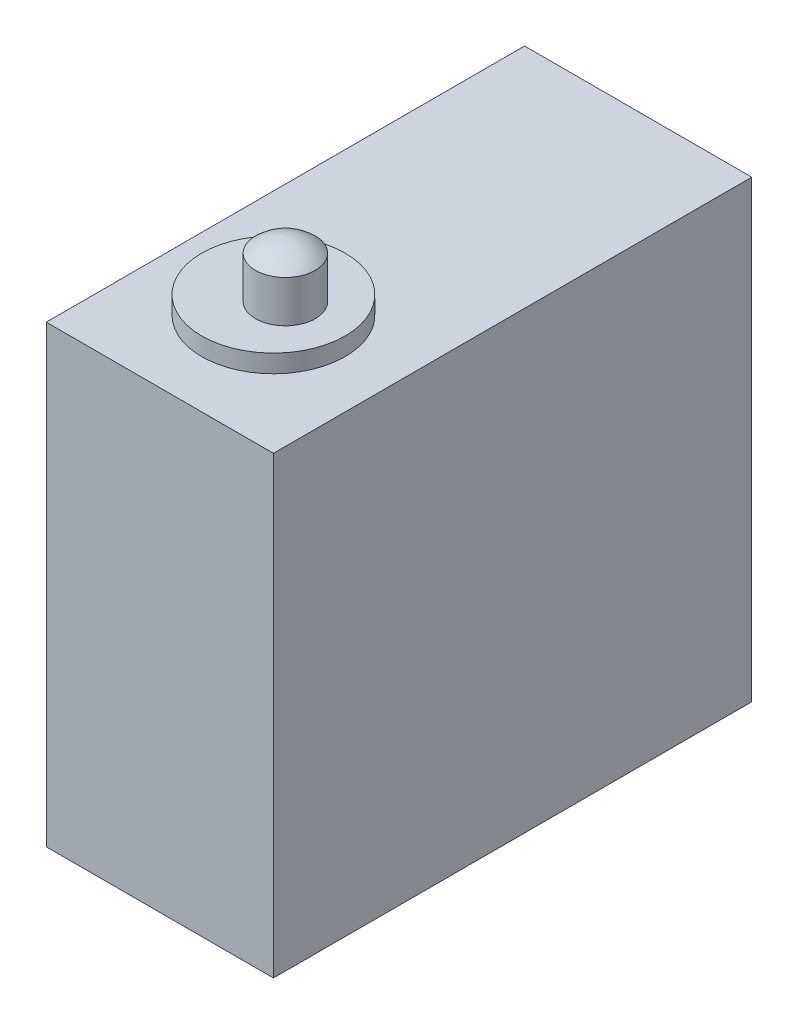
ISO-10303-21;
HEADER;
FILE_DESCRIPTION(('STEP AP214'),'2;1');
FILE_NAME('part.step','',(''),(''),'','','');
FILE_SCHEMA(('AUTOMOTIVE_DESIGN { 1 0 10303 214 1 1 1 1 }'));
ENDSEC;
DATA;
#1=APPLICATION_CONTEXT('core data for automotive mechanical design processes');
#2=APPLICATION_PROTOCOL_DEFINITION('international standard','automotive_design',2000,#1);
#3=PRODUCT_CONTEXT('',#1,'mechanical');
#4=PRODUCT('Part','Part','',(#3));
#5=PRODUCT_RELATED_PRODUCT_CATEGORY('part','',(#4));
#6=PRODUCT_DEFINITION_FORMATION('','',#4);
#7=PRODUCT_DEFINITION_CONTEXT('part definition',#1,'design');
#8=PRODUCT_DEFINITION('design','',#6,#7);
#9=PRODUCT_DEFINITION_SHAPE('','',#8);
#10=(LENGTH_UNIT() NAMED_UNIT(*) SI_UNIT(.MILLI.,.METRE.));
#11=(NAMED_UNIT(*) PLANE_ANGLE_UNIT() SI_UNIT($,.RADIAN.));
#12=(NAMED_UNIT(*) SI_UNIT($,.STERADIAN.) SOLID_ANGLE_UNIT());
#13=UNCERTAINTY_MEASURE_WITH_UNIT(LENGTH_MEASURE(1.E-05),#10,'distance_accuracy_value','');
#14=(GEOMETRIC_REPRESENTATION_CONTEXT(3) GLOBAL_UNCERTAINTY_ASSIGNED_CONTEXT((#13)) GLOBAL_UNIT_ASSIGNED_CONTEXT((#10,
#11,#12)) REPRESENTATION_CONTEXT('',''));
#15=CARTESIAN_POINT('',(0.,0.,0.));
#16=DIRECTION('',(0.,0.,1.));
#17=DIRECTION('',(1.,0.,0.));
#18=AXIS2_PLACEMENT_3D('',#15,#16,#17);
#19=CARTESIAN_POINT('',(9.,18.8368210648164,14.8337322002499));
#20=DIRECTION('',(0.,1.,0.));
#21=DIRECTION('',(0.,0.,1.));
#22=AXIS2_PLACEMENT_3D('',#19,#20,#21);
#23=PLANE('',#22);
#24=CARTESIAN_POINT('',(9.,18.8368210648164,14.8337322002499));
#25=DIRECTION('',(0.,1.,0.));
#26=DIRECTION('',(0.,0.,1.));
#27=AXIS2_PLACEMENT_3D('',#24,#25,#26);
#28=CIRCLE('',#27,6.);
#29=CARTESIAN_POINT('',(9.,18.8368210648164,20.8337322002499));
#30=VERTEX_POINT('',#29);
#31=EDGE_CURVE('E102',#30,#30,#28,.T.);
#32=ORIENTED_EDGE('',*,*,#31,.T.);
#33=EDGE_LOOP('',(#32));
#34=FACE_BOUND('',#33,.T.);
#35=CARTESIAN_POINT('',(10.,18.8368210648164,14.8337322002499));
#36=DIRECTION('',(0.,1.,0.));
#37=DIRECTION('',(0.,0.,1.));
#38=AXIS2_PLACEMENT_3D('',#35,#36,#37);
#39=CIRCLE('',#38,2.5);
#40=CARTESIAN_POINT('',(10.,18.8368210648164,17.3337322002499));
#41=VERTEX_POINT('',#40);
#42=EDGE_CURVE('E147',#41,#41,#39,.T.);
#43=ORIENTED_EDGE('',*,*,#42,.F.);
#44=EDGE_LOOP('',(#43));
#45=FACE_BOUND('',#44,.T.);
#46=ADVANCED_FACE('F30',(#34,#45),#23,.T.);
#47=CARTESIAN_POINT('',(19.,17.3368210648164,-15.1662677997501));
#48=DIRECTION('',(0.,-1.,0.));
#49=DIRECTION('',(0.,0.,-1.));
#50=AXIS2_PLACEMENT_3D('',#47,#48,#49);
#51=PLANE('',#50);
#52=DIRECTION('',(0.,0.,1.));
#53=VECTOR('',#52,1.);
#54=CARTESIAN_POINT('',(0.,17.3368210648164,-15.1662677997501));
#55=LINE('',#54,#53);
#56=CARTESIAN_POINT('',(0.,17.3368210648164,-15.1662677997501));
#57=VERTEX_POINT('',#56);
#58=CARTESIAN_POINT('',(0.,17.3368210648164,24.8337322002499));
#59=VERTEX_POINT('',#58);
#60=EDGE_CURVE('E90',#57,#59,#55,.T.);
#61=ORIENTED_EDGE('',*,*,#60,.T.);
#62=DIRECTION('',(-1.,0.,0.));
#63=VECTOR('',#62,1.);
#64=CARTESIAN_POINT('',(19.,17.3368210648164,24.8337322002499));
#65=LINE('',#64,#63);
#66=CARTESIAN_POINT('',(19.,17.3368210648164,24.8337322002499));
#67=VERTEX_POINT('',#66);
#68=EDGE_CURVE('E87',#67,#59,#65,.T.);
#69=ORIENTED_EDGE('',*,*,#68,.F.);
#70=DIRECTION('',(0.,0.,1.));
#71=VECTOR('',#70,1.);
#72=CARTESIAN_POINT('',(19.,17.3368210648164,-15.1662677997501));
#73=LINE('',#72,#71);
#74=CARTESIAN_POINT('',(19.,17.3368210648164,-15.1662677997501));
#75=VERTEX_POINT('',#74);
#76=EDGE_CURVE('E79',#75,#67,#73,.T.);
#77=ORIENTED_EDGE('',*,*,#76,.F.);
#78=DIRECTION('',(-1.,0.,0.));
#79=VECTOR('',#78,1.);
#80=CARTESIAN_POINT('',(19.,17.3368210648164,-15.1662677997501));
#81=LINE('',#80,#79);
#82=EDGE_CURVE('E40',#75,#57,#81,.T.);
#83=ORIENTED_EDGE('',*,*,#82,.T.);
#84=EDGE_LOOP('',(#61,#69,#77,#83));
#85=FACE_BOUND('',#84,.T.);
#86=CARTESIAN_POINT('',(9.,17.3368210648164,14.8337322002499));
#87=DIRECTION('',(0.,-1.,0.));
#88=DIRECTION('',(0.,0.,-1.));
#89=AXIS2_PLACEMENT_3D('',#86,#87,#88);
#90=CIRCLE('',#89,6.);
#91=CARTESIAN_POINT('',(9.,17.3368210648164,8.83373220024987));
#92=VERTEX_POINT('',#91);
#93=EDGE_CURVE('E11',#92,#92,#90,.F.);
#94=ORIENTED_EDGE('',*,*,#93,.F.);
#95=EDGE_LOOP('',(#94));
#96=FACE_BOUND('',#95,.T.);
#97=ADVANCED_FACE('F88',(#85,#96),#51,.F.);
#98=CARTESIAN_POINT('',(19.,17.3368210648164,-15.1662677997501));
#99=DIRECTION('',(0.,0.,1.));
#100=DIRECTION('',(0.,-1.,0.));
#101=AXIS2_PLACEMENT_3D('',#98,#99,#100);
#102=PLANE('',#101);
#103=DIRECTION('',(0.,1.,0.));
#104=VECTOR('',#103,1.);
#105=CARTESIAN_POINT('',(0.,17.3368210648164,-15.1662677997501));
#106=LINE('',#105,#104);
#107=CARTESIAN_POINT('',(0.,-20.6631789351836,-15.1662677997501));
#108=VERTEX_POINT('',#107);
#109=EDGE_CURVE('E99',#108,#57,#106,.T.);
#110=ORIENTED_EDGE('',*,*,#109,.T.);
#111=ORIENTED_EDGE('',*,*,#82,.F.);
#112=DIRECTION('',(0.,1.,0.));
#113=VECTOR('',#112,1.);
#114=CARTESIAN_POINT('',(19.,17.3368210648164,-15.1662677997501));
#115=LINE('',#114,#113);
#116=CARTESIAN_POINT('',(19.,-20.6631789351836,-15.1662677997501));
#117=VERTEX_POINT('',#116);
#118=EDGE_CURVE('E84',#117,#75,#115,.T.);
#119=ORIENTED_EDGE('',*,*,#118,.F.);
#120=DIRECTION('',(-1.,0.,0.));
#121=VECTOR('',#120,1.);
#122=CARTESIAN_POINT('',(19.,-20.6631789351836,-15.1662677997501));
#123=LINE('',#122,#121);
#124=EDGE_CURVE('E95',#117,#108,#123,.T.);
#125=ORIENTED_EDGE('',*,*,#124,.T.);
#126=EDGE_LOOP('',(#110,#111,#119,#125));
#127=FACE_BOUND('',#126,.T.);
#128=ADVANCED_FACE('F110',(#127),#102,.F.);
#129=CARTESIAN_POINT('',(19.,17.3368210648164,24.8337322002499));
#130=DIRECTION('',(0.,0.,-1.));
#131=DIRECTION('',(0.,1.,0.));
#132=AXIS2_PLACEMENT_3D('',#129,#130,#131);
#133=PLANE('',#132);
#134=DIRECTION('',(0.,-1.,0.));
#135=VECTOR('',#134,1.);
#136=CARTESIAN_POINT('',(0.,17.3368210648164,24.8337322002499));
#137=LINE('',#136,#135);
#138=CARTESIAN_POINT('',(0.,-20.6631789351836,24.8337322002499));
#139=VERTEX_POINT('',#138);
#140=EDGE_CURVE('E65',#59,#139,#137,.T.);
#141=ORIENTED_EDGE('',*,*,#140,.T.);
#142=DIRECTION('',(-1.,0.,0.));
#143=VECTOR('',#142,1.);
#144=CARTESIAN_POINT('',(19.,-20.6631789351836,24.8337322002499));
#145=LINE('',#144,#143);
#146=CARTESIAN_POINT('',(19.,-20.6631789351836,24.8337322002499));
#147=VERTEX_POINT('',#146);
#148=EDGE_CURVE('E91',#147,#139,#145,.T.);
#149=ORIENTED_EDGE('',*,*,#148,.F.);
#150=DIRECTION('',(0.,-1.,0.));
#151=VECTOR('',#150,1.);
#152=CARTESIAN_POINT('',(19.,17.3368210648164,24.8337322002499));
#153=LINE('',#152,#151);
#154=EDGE_CURVE('E82',#67,#147,#153,.T.);
#155=ORIENTED_EDGE('',*,*,#154,.F.);
#156=ORIENTED_EDGE('',*,*,#68,.T.);
#157=EDGE_LOOP('',(#141,#149,#155,#156));
#158=FACE_BOUND('',#157,.T.);
#159=ADVANCED_FACE('F93',(#158),#133,.F.);
#160=CARTESIAN_POINT('',(19.,-20.6631789351836,-15.1662677997501));
#161=DIRECTION('',(0.,1.,0.));
#162=DIRECTION('',(0.,0.,1.));
#163=AXIS2_PLACEMENT_3D('',#160,#161,#162);
#164=PLANE('',#163);
#165=DIRECTION('',(0.,0.,-1.));
#166=VECTOR('',#165,1.);
#167=CARTESIAN_POINT('',(0.,-20.6631789351836,-15.1662677997501));
#168=LINE('',#167,#166);
#169=EDGE_CURVE('E71',#139,#108,#168,.T.);
#170=ORIENTED_EDGE('',*,*,#169,.T.);
#171=ORIENTED_EDGE('',*,*,#124,.F.);
#172=DIRECTION('',(0.,0.,-1.));
#173=VECTOR('',#172,1.);
#174=CARTESIAN_POINT('',(19.,-20.6631789351836,-15.1662677997501));
#175=LINE('',#174,#173);
#176=EDGE_CURVE('E48',#147,#117,#175,.T.);
#177=ORIENTED_EDGE('',*,*,#176,.F.);
#178=ORIENTED_EDGE('',*,*,#148,.T.);
#179=EDGE_LOOP('',(#170,#171,#177,#178));
#180=FACE_BOUND('',#179,.T.);
#181=ADVANCED_FACE('F123',(#180),#164,.F.);
#182=CARTESIAN_POINT('',(19.,-20.6631789351836,-15.1662677997501));
#183=DIRECTION('',(-1.,0.,0.));
#184=DIRECTION('',(0.,0.,1.));
#185=AXIS2_PLACEMENT_3D('',#182,#183,#184);
#186=PLANE('',#185);
#187=ORIENTED_EDGE('',*,*,#118,.T.);
#188=ORIENTED_EDGE('',*,*,#76,.T.);
#189=ORIENTED_EDGE('',*,*,#154,.T.);
#190=ORIENTED_EDGE('',*,*,#176,.T.);
#191=EDGE_LOOP('',(#187,#188,#189,#190));
#192=FACE_BOUND('',#191,.T.);
#193=ADVANCED_FACE('F80',(#192),#186,.F.);
#194=CARTESIAN_POINT('',(0.,-20.6631789351836,-15.1662677997501));
#195=DIRECTION('',(-1.,0.,0.));
#196=DIRECTION('',(0.,0.,1.));
#197=AXIS2_PLACEMENT_3D('',#194,#195,#196);
#198=PLANE('',#197);
#199=ORIENTED_EDGE('',*,*,#109,.F.);
#200=ORIENTED_EDGE('',*,*,#169,.F.);
#201=ORIENTED_EDGE('',*,*,#140,.F.);
#202=ORIENTED_EDGE('',*,*,#60,.F.);
#203=EDGE_LOOP('',(#199,#200,#201,#202));
#204=FACE_BOUND('',#203,.T.);
#205=ADVANCED_FACE('F112',(#204),#198,.T.);
#206=CARTESIAN_POINT('',(9.,18.8368210648164,14.8337322002499));
#207=DIRECTION('',(0.,-1.,0.));
#208=DIRECTION('',(0.,0.,-1.));
#209=AXIS2_PLACEMENT_3D('',#206,#207,#208);
#210=CYLINDRICAL_SURFACE('',#209,6.);
#211=ORIENTED_EDGE('',*,*,#31,.F.);
#212=EDGE_LOOP('',(#211));
#213=FACE_BOUND('',#212,.T.);
#214=ORIENTED_EDGE('',*,*,#93,.T.);
#215=EDGE_LOOP('',(#214));
#216=FACE_BOUND('',#215,.T.);
#217=ADVANCED_FACE('F114',(#213,#216),#210,.T.);
#218=CARTESIAN_POINT('',(10.,22.3368210648164,14.8337322002499));
#219=DIRECTION('',(0.,-1.,0.));
#220=DIRECTION('',(0.,0.,-1.));
#221=AXIS2_PLACEMENT_3D('',#218,#219,#220);
#222=CYLINDRICAL_SURFACE('',#221,2.5);
#223=CARTESIAN_POINT('',(10.,22.3368210648164,14.8337322002499));
#224=DIRECTION('',(0.,1.,0.));
#225=DIRECTION('',(0.,0.,1.));
#226=AXIS2_PLACEMENT_3D('',#223,#224,#225);
#227=CIRCLE('',#226,2.5);
#228=CARTESIAN_POINT('',(10.,22.3368210648164,17.3337322002499));
#229=VERTEX_POINT('',#228);
#230=EDGE_CURVE('E34',#229,#229,#227,.T.);
#231=ORIENTED_EDGE('',*,*,#230,.F.);
#232=EDGE_LOOP('',(#231));
#233=FACE_BOUND('',#232,.T.);
#234=ORIENTED_EDGE('',*,*,#42,.T.);
#235=EDGE_LOOP('',(#234));
#236=FACE_BOUND('',#235,.T.);
#237=ADVANCED_FACE('F120',(#233,#236),#222,.T.);
#238=CARTESIAN_POINT('',(10.,19.7118210648164,14.8337322002499));
#239=DIRECTION('',(0.,0.,1.));
#240=DIRECTION('',(1.,0.,0.));
#241=AXIS2_PLACEMENT_3D('',#238,#239,#240);
#242=SPHERICAL_SURFACE('',#241,3.625);
#243=CARTESIAN_POINT('',(10.,19.7118210648164,14.8337322002499));
#244=DIRECTION('',(0.,1.,0.));
#245=DIRECTION('',(0.,0.,1.));
#246=AXIS2_PLACEMENT_3D('',#243,#244,#245);
#247=SPHERICAL_SURFACE('',#246,3.625);
#248=ORIENTED_EDGE('',*,*,#230,.T.);
#249=EDGE_LOOP('',(#248));
#250=FACE_BOUND('',#249,.T.);
#251=ADVANCED_FACE('F32',(#250),#247,.T.);
#252=CLOSED_SHELL('',(#46,#97,#128,#159,#181,#193,#205,#217,#237,#251));
#253=MANIFOLD_SOLID_BREP('B2',#252);
#254=ADVANCED_BREP_SHAPE_REPRESENTATION('',(#18,#253),#14);
#255=SHAPE_DEFINITION_REPRESENTATION(#9,#254);
ENDSEC;
END-ISO-10303-21;
